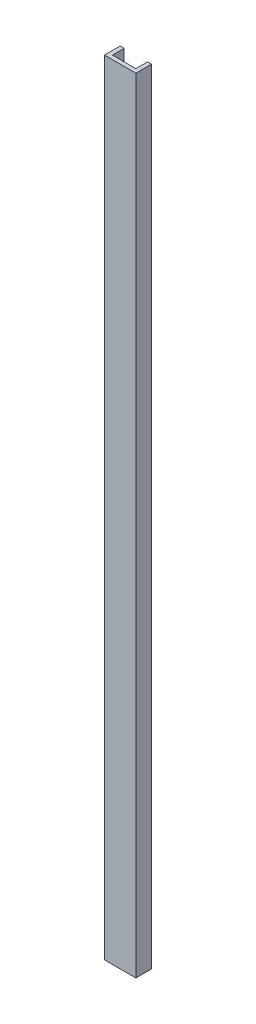
ISO-10303-21;
HEADER;
FILE_DESCRIPTION(('STEP AP214'),'2;1');
FILE_NAME('part.step','',(''),(''),'','','');
FILE_SCHEMA(('AUTOMOTIVE_DESIGN { 1 0 10303 214 1 1 1 1 }'));
ENDSEC;
DATA;
#1=APPLICATION_CONTEXT('core data for automotive mechanical design processes');
#2=APPLICATION_PROTOCOL_DEFINITION('international standard','automotive_design',2000,#1);
#3=PRODUCT_CONTEXT('',#1,'mechanical');
#4=PRODUCT('Part','Part','',(#3));
#5=PRODUCT_RELATED_PRODUCT_CATEGORY('part','',(#4));
#6=PRODUCT_DEFINITION_FORMATION('','',#4);
#7=PRODUCT_DEFINITION_CONTEXT('part definition',#1,'design');
#8=PRODUCT_DEFINITION('design','',#6,#7);
#9=PRODUCT_DEFINITION_SHAPE('','',#8);
#10=(LENGTH_UNIT() NAMED_UNIT(*) SI_UNIT(.MILLI.,.METRE.));
#11=(NAMED_UNIT(*) PLANE_ANGLE_UNIT() SI_UNIT($,.RADIAN.));
#12=(NAMED_UNIT(*) SI_UNIT($,.STERADIAN.) SOLID_ANGLE_UNIT());
#13=UNCERTAINTY_MEASURE_WITH_UNIT(LENGTH_MEASURE(1.E-05),#10,'distance_accuracy_value','');
#14=(GEOMETRIC_REPRESENTATION_CONTEXT(3) GLOBAL_UNCERTAINTY_ASSIGNED_CONTEXT((#13)) GLOBAL_UNIT_ASSIGNED_CONTEXT((#10,
#11,#12)) REPRESENTATION_CONTEXT('',''));
#15=CARTESIAN_POINT('',(0.,0.,0.));
#16=DIRECTION('',(0.,0.,1.));
#17=DIRECTION('',(1.,0.,0.));
#18=AXIS2_PLACEMENT_3D('',#15,#16,#17);
#19=CARTESIAN_POINT('',(0.,635.,80.5761067555287));
#20=DIRECTION('',(0.,0.,-1.));
#21=DIRECTION('',(-1.,0.,0.));
#22=AXIS2_PLACEMENT_3D('',#19,#20,#21);
#23=PLANE('',#22);
#24=DIRECTION('',(1.,0.,0.));
#25=VECTOR('',#24,1.);
#26=CARTESIAN_POINT('',(0.,0.,80.5761067555287));
#27=LINE('',#26,#25);
#28=CARTESIAN_POINT('',(-18.7864769917139,0.,80.5761067555287));
#29=VERTEX_POINT('',#28);
#30=CARTESIAN_POINT('',(-15.6114769917139,0.,80.5761067555287));
#31=VERTEX_POINT('',#30);
#32=EDGE_CURVE('E130',#29,#31,#27,.T.);
#33=ORIENTED_EDGE('',*,*,#32,.F.);
#34=DIRECTION('',(0.,-1.,0.));
#35=VECTOR('',#34,1.);
#36=CARTESIAN_POINT('',(-18.7864769917139,635.,80.5761067555287));
#37=LINE('',#36,#35);
#38=CARTESIAN_POINT('',(-18.7864769917139,635.,80.5761067555287));
#39=VERTEX_POINT('',#38);
#40=EDGE_CURVE('E11',#39,#29,#37,.T.);
#41=ORIENTED_EDGE('',*,*,#40,.F.);
#42=DIRECTION('',(1.,0.,0.));
#43=VECTOR('',#42,1.);
#44=CARTESIAN_POINT('',(0.,635.,80.5761067555287));
#45=LINE('',#44,#43);
#46=CARTESIAN_POINT('',(-15.6114769917139,635.,80.5761067555287));
#47=VERTEX_POINT('',#46);
#48=EDGE_CURVE('E148',#39,#47,#45,.T.);
#49=ORIENTED_EDGE('',*,*,#48,.T.);
#50=DIRECTION('',(0.,-1.,0.));
#51=VECTOR('',#50,1.);
#52=CARTESIAN_POINT('',(-15.6114769917139,635.,80.5761067555287));
#53=LINE('',#52,#51);
#54=EDGE_CURVE('E52',#47,#31,#53,.T.);
#55=ORIENTED_EDGE('',*,*,#54,.T.);
#56=EDGE_LOOP('',(#33,#41,#49,#55));
#57=FACE_BOUND('',#56,.T.);
#58=ADVANCED_FACE('F35',(#57),#23,.T.);
#59=CARTESIAN_POINT('',(-18.7864769917139,635.,0.));
#60=DIRECTION('',(1.,0.,0.));
#61=DIRECTION('',(0.,0.,-1.));
#62=AXIS2_PLACEMENT_3D('',#59,#60,#61);
#63=PLANE('',#62);
#64=DIRECTION('',(0.,0.,1.));
#65=VECTOR('',#64,1.);
#66=CARTESIAN_POINT('',(-18.7864769917139,0.,0.));
#67=LINE('',#66,#65);
#68=CARTESIAN_POINT('',(-18.7864769917139,0.,90.1011067555287));
#69=VERTEX_POINT('',#68);
#70=EDGE_CURVE('E132',#29,#69,#67,.T.);
#71=ORIENTED_EDGE('',*,*,#70,.T.);
#72=DIRECTION('',(0.,-1.,0.));
#73=VECTOR('',#72,1.);
#74=CARTESIAN_POINT('',(-18.7864769917139,635.,90.1011067555287));
#75=LINE('',#74,#73);
#76=CARTESIAN_POINT('',(-18.7864769917139,635.,90.1011067555287));
#77=VERTEX_POINT('',#76);
#78=EDGE_CURVE('E44',#77,#69,#75,.T.);
#79=ORIENTED_EDGE('',*,*,#78,.F.);
#80=DIRECTION('',(0.,0.,1.));
#81=VECTOR('',#80,1.);
#82=CARTESIAN_POINT('',(-18.7864769917139,635.,0.));
#83=LINE('',#82,#81);
#84=EDGE_CURVE('E173',#39,#77,#83,.T.);
#85=ORIENTED_EDGE('',*,*,#84,.F.);
#86=ORIENTED_EDGE('',*,*,#40,.T.);
#87=EDGE_LOOP('',(#71,#79,#85,#86));
#88=FACE_BOUND('',#87,.T.);
#89=ADVANCED_FACE('F37',(#88),#63,.F.);
#90=CARTESIAN_POINT('',(0.,635.,90.1011067555287));
#91=DIRECTION('',(0.,0.,-1.));
#92=DIRECTION('',(-1.,0.,0.));
#93=AXIS2_PLACEMENT_3D('',#90,#91,#92);
#94=PLANE('',#93);
#95=DIRECTION('',(1.,0.,0.));
#96=VECTOR('',#95,1.);
#97=CARTESIAN_POINT('',(0.,0.,90.1011067555287));
#98=LINE('',#97,#96);
#99=CARTESIAN_POINT('',(-37.8364769917139,0.,90.1011067555287));
#100=VERTEX_POINT('',#99);
#101=EDGE_CURVE('E136',#100,#69,#98,.T.);
#102=ORIENTED_EDGE('',*,*,#101,.F.);
#103=DIRECTION('',(0.,-1.,0.));
#104=VECTOR('',#103,1.);
#105=CARTESIAN_POINT('',(-37.8364769917139,635.,90.1011067555287));
#106=LINE('',#105,#104);
#107=CARTESIAN_POINT('',(-37.8364769917139,635.,90.1011067555287));
#108=VERTEX_POINT('',#107);
#109=EDGE_CURVE('E154',#108,#100,#106,.T.);
#110=ORIENTED_EDGE('',*,*,#109,.F.);
#111=DIRECTION('',(1.,0.,0.));
#112=VECTOR('',#111,1.);
#113=CARTESIAN_POINT('',(0.,635.,90.1011067555287));
#114=LINE('',#113,#112);
#115=EDGE_CURVE('E161',#108,#77,#114,.T.);
#116=ORIENTED_EDGE('',*,*,#115,.T.);
#117=ORIENTED_EDGE('',*,*,#78,.T.);
#118=EDGE_LOOP('',(#102,#110,#116,#117));
#119=FACE_BOUND('',#118,.T.);
#120=ADVANCED_FACE('F159',(#119),#94,.T.);
#121=CARTESIAN_POINT('',(-37.8364769917138,635.,0.));
#122=DIRECTION('',(1.,0.,0.));
#123=DIRECTION('',(0.,0.,-1.));
#124=AXIS2_PLACEMENT_3D('',#121,#122,#123);
#125=PLANE('',#124);
#126=DIRECTION('',(0.,0.,1.));
#127=VECTOR('',#126,1.);
#128=CARTESIAN_POINT('',(-37.8364769917138,0.,0.));
#129=LINE('',#128,#127);
#130=CARTESIAN_POINT('',(-37.8364769917139,0.,80.5761067555287));
#131=VERTEX_POINT('',#130);
#132=EDGE_CURVE('E139',#131,#100,#129,.T.);
#133=ORIENTED_EDGE('',*,*,#132,.F.);
#134=DIRECTION('',(0.,-1.,0.));
#135=VECTOR('',#134,1.);
#136=CARTESIAN_POINT('',(-37.8364769917139,635.,80.5761067555287));
#137=LINE('',#136,#135);
#138=CARTESIAN_POINT('',(-37.8364769917139,635.,80.5761067555287));
#139=VERTEX_POINT('',#138);
#140=EDGE_CURVE('E152',#139,#131,#137,.T.);
#141=ORIENTED_EDGE('',*,*,#140,.F.);
#142=DIRECTION('',(0.,0.,1.));
#143=VECTOR('',#142,1.);
#144=CARTESIAN_POINT('',(-37.8364769917138,635.,0.));
#145=LINE('',#144,#143);
#146=EDGE_CURVE('E172',#139,#108,#145,.T.);
#147=ORIENTED_EDGE('',*,*,#146,.T.);
#148=ORIENTED_EDGE('',*,*,#109,.T.);
#149=EDGE_LOOP('',(#133,#141,#147,#148));
#150=FACE_BOUND('',#149,.T.);
#151=ADVANCED_FACE('F170',(#150),#125,.T.);
#152=CARTESIAN_POINT('',(-41.0114769917139,0.,80.5761067555287));
#153=VERTEX_POINT('',#152);
#154=EDGE_CURVE('E133',#153,#131,#27,.T.);
#155=ORIENTED_EDGE('',*,*,#154,.F.);
#156=DIRECTION('',(0.,-1.,0.));
#157=VECTOR('',#156,1.);
#158=CARTESIAN_POINT('',(-41.0114769917139,635.,80.5761067555287));
#159=LINE('',#158,#157);
#160=CARTESIAN_POINT('',(-41.0114769917139,635.,80.5761067555287));
#161=VERTEX_POINT('',#160);
#162=EDGE_CURVE('E122',#161,#153,#159,.T.);
#163=ORIENTED_EDGE('',*,*,#162,.F.);
#164=EDGE_CURVE('E112',#161,#139,#45,.T.);
#165=ORIENTED_EDGE('',*,*,#164,.T.);
#166=ORIENTED_EDGE('',*,*,#140,.T.);
#167=EDGE_LOOP('',(#155,#163,#165,#166));
#168=FACE_BOUND('',#167,.T.);
#169=ADVANCED_FACE('F178',(#168),#23,.T.);
#170=CARTESIAN_POINT('',(-41.0114769917139,635.,0.));
#171=DIRECTION('',(1.,0.,0.));
#172=DIRECTION('',(0.,0.,-1.));
#173=AXIS2_PLACEMENT_3D('',#170,#171,#172);
#174=PLANE('',#173);
#175=DIRECTION('',(0.,0.,1.));
#176=VECTOR('',#175,1.);
#177=CARTESIAN_POINT('',(-41.0114769917139,0.,0.));
#178=LINE('',#177,#176);
#179=CARTESIAN_POINT('',(-41.0114769917139,0.,93.2761067555287));
#180=VERTEX_POINT('',#179);
#181=EDGE_CURVE('E119',#153,#180,#178,.T.);
#182=ORIENTED_EDGE('',*,*,#181,.T.);
#183=DIRECTION('',(0.,-1.,0.));
#184=VECTOR('',#183,1.);
#185=CARTESIAN_POINT('',(-41.0114769917139,635.,93.2761067555287));
#186=LINE('',#185,#184);
#187=CARTESIAN_POINT('',(-41.0114769917139,635.,93.2761067555287));
#188=VERTEX_POINT('',#187);
#189=EDGE_CURVE('E116',#188,#180,#186,.T.);
#190=ORIENTED_EDGE('',*,*,#189,.F.);
#191=DIRECTION('',(0.,0.,1.));
#192=VECTOR('',#191,1.);
#193=CARTESIAN_POINT('',(-41.0114769917139,635.,0.));
#194=LINE('',#193,#192);
#195=EDGE_CURVE('E103',#161,#188,#194,.T.);
#196=ORIENTED_EDGE('',*,*,#195,.F.);
#197=ORIENTED_EDGE('',*,*,#162,.T.);
#198=EDGE_LOOP('',(#182,#190,#196,#197));
#199=FACE_BOUND('',#198,.T.);
#200=ADVANCED_FACE('F117',(#199),#174,.F.);
#201=CARTESIAN_POINT('',(0.,635.,93.2761067555287));
#202=DIRECTION('',(0.,0.,-1.));
#203=DIRECTION('',(-1.,0.,0.));
#204=AXIS2_PLACEMENT_3D('',#201,#202,#203);
#205=PLANE('',#204);
#206=DIRECTION('',(1.,0.,0.));
#207=VECTOR('',#206,1.);
#208=CARTESIAN_POINT('',(0.,0.,93.2761067555287));
#209=LINE('',#208,#207);
#210=CARTESIAN_POINT('',(-15.6114769917139,0.,93.2761067555287));
#211=VERTEX_POINT('',#210);
#212=EDGE_CURVE('E143',#180,#211,#209,.T.);
#213=ORIENTED_EDGE('',*,*,#212,.T.);
#214=DIRECTION('',(0.,-1.,0.));
#215=VECTOR('',#214,1.);
#216=CARTESIAN_POINT('',(-15.6114769917139,635.,93.2761067555287));
#217=LINE('',#216,#215);
#218=CARTESIAN_POINT('',(-15.6114769917139,635.,93.2761067555287));
#219=VERTEX_POINT('',#218);
#220=EDGE_CURVE('E78',#219,#211,#217,.T.);
#221=ORIENTED_EDGE('',*,*,#220,.F.);
#222=DIRECTION('',(1.,0.,0.));
#223=VECTOR('',#222,1.);
#224=CARTESIAN_POINT('',(0.,635.,93.2761067555287));
#225=LINE('',#224,#223);
#226=EDGE_CURVE('E109',#188,#219,#225,.T.);
#227=ORIENTED_EDGE('',*,*,#226,.F.);
#228=ORIENTED_EDGE('',*,*,#189,.T.);
#229=EDGE_LOOP('',(#213,#221,#227,#228));
#230=FACE_BOUND('',#229,.T.);
#231=ADVANCED_FACE('F124',(#230),#205,.F.);
#232=CARTESIAN_POINT('',(-15.6114769917139,635.,0.));
#233=DIRECTION('',(1.,0.,0.));
#234=DIRECTION('',(0.,0.,-1.));
#235=AXIS2_PLACEMENT_3D('',#232,#233,#234);
#236=PLANE('',#235);
#237=DIRECTION('',(0.,0.,1.));
#238=VECTOR('',#237,1.);
#239=CARTESIAN_POINT('',(-15.6114769917139,0.,0.));
#240=LINE('',#239,#238);
#241=EDGE_CURVE('E145',#31,#211,#240,.T.);
#242=ORIENTED_EDGE('',*,*,#241,.F.);
#243=ORIENTED_EDGE('',*,*,#54,.F.);
#244=DIRECTION('',(0.,0.,1.));
#245=VECTOR('',#244,1.);
#246=CARTESIAN_POINT('',(-15.6114769917139,635.,0.));
#247=LINE('',#246,#245);
#248=EDGE_CURVE('E125',#47,#219,#247,.T.);
#249=ORIENTED_EDGE('',*,*,#248,.T.);
#250=ORIENTED_EDGE('',*,*,#220,.T.);
#251=EDGE_LOOP('',(#242,#243,#249,#250));
#252=FACE_BOUND('',#251,.T.);
#253=ADVANCED_FACE('F179',(#252),#236,.T.);
#254=CARTESIAN_POINT('',(0.,635.,0.));
#255=DIRECTION('',(0.,1.,0.));
#256=DIRECTION('',(0.,0.,1.));
#257=AXIS2_PLACEMENT_3D('',#254,#255,#256);
#258=PLANE('',#257);
#259=ORIENTED_EDGE('',*,*,#48,.F.);
#260=ORIENTED_EDGE('',*,*,#84,.T.);
#261=ORIENTED_EDGE('',*,*,#115,.F.);
#262=ORIENTED_EDGE('',*,*,#146,.F.);
#263=ORIENTED_EDGE('',*,*,#164,.F.);
#264=ORIENTED_EDGE('',*,*,#195,.T.);
#265=ORIENTED_EDGE('',*,*,#226,.T.);
#266=ORIENTED_EDGE('',*,*,#248,.F.);
#267=EDGE_LOOP('',(#259,#260,#261,#262,#263,#264,#265,#266));
#268=FACE_BOUND('',#267,.T.);
#269=ADVANCED_FACE('F106',(#268),#258,.T.);
#270=CARTESIAN_POINT('',(0.,0.,0.));
#271=DIRECTION('',(0.,1.,0.));
#272=DIRECTION('',(0.,0.,1.));
#273=AXIS2_PLACEMENT_3D('',#270,#271,#272);
#274=PLANE('',#273);
#275=ORIENTED_EDGE('',*,*,#32,.T.);
#276=ORIENTED_EDGE('',*,*,#241,.T.);
#277=ORIENTED_EDGE('',*,*,#212,.F.);
#278=ORIENTED_EDGE('',*,*,#181,.F.);
#279=ORIENTED_EDGE('',*,*,#154,.T.);
#280=ORIENTED_EDGE('',*,*,#132,.T.);
#281=ORIENTED_EDGE('',*,*,#101,.T.);
#282=ORIENTED_EDGE('',*,*,#70,.F.);
#283=EDGE_LOOP('',(#275,#276,#277,#278,#279,#280,#281,#282));
#284=FACE_BOUND('',#283,.T.);
#285=ADVANCED_FACE('F165',(#284),#274,.F.);
#286=CLOSED_SHELL('',(#58,#89,#120,#151,#169,#200,#231,#253,#269,#285));
#287=MANIFOLD_SOLID_BREP('B2',#286);
#288=ADVANCED_BREP_SHAPE_REPRESENTATION('',(#18,#287),#14);
#289=SHAPE_DEFINITION_REPRESENTATION(#9,#288);
ENDSEC;
END-ISO-10303-21;
